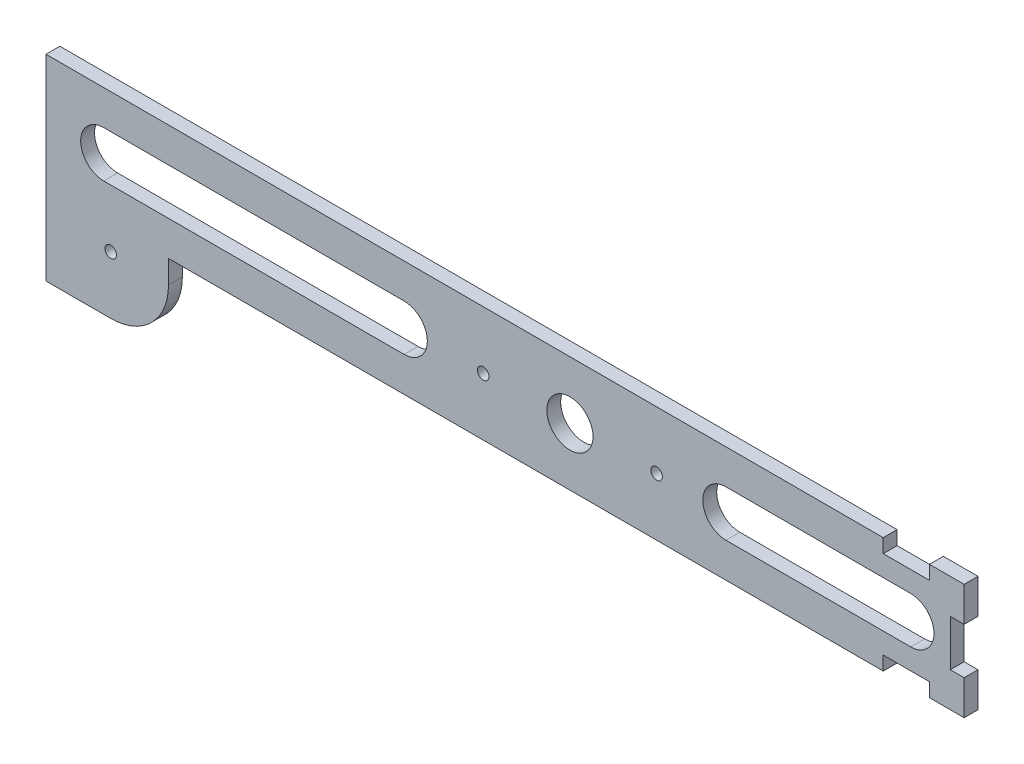
ISO-10303-21;
HEADER;
FILE_DESCRIPTION(('STEP AP214'),'2;1');
FILE_NAME('part.step','',(''),(''),'','','');
FILE_SCHEMA(('AUTOMOTIVE_DESIGN { 1 0 10303 214 1 1 1 1 }'));
ENDSEC;
DATA;
#1=APPLICATION_CONTEXT('core data for automotive mechanical design processes');
#2=APPLICATION_PROTOCOL_DEFINITION('international standard','automotive_design',2000,#1);
#3=PRODUCT_CONTEXT('',#1,'mechanical');
#4=PRODUCT('Part','Part','',(#3));
#5=PRODUCT_RELATED_PRODUCT_CATEGORY('part','',(#4));
#6=PRODUCT_DEFINITION_FORMATION('','',#4);
#7=PRODUCT_DEFINITION_CONTEXT('part definition',#1,'design');
#8=PRODUCT_DEFINITION('design','',#6,#7);
#9=PRODUCT_DEFINITION_SHAPE('','',#8);
#10=(LENGTH_UNIT() NAMED_UNIT(*) SI_UNIT(.MILLI.,.METRE.));
#11=(NAMED_UNIT(*) PLANE_ANGLE_UNIT() SI_UNIT($,.RADIAN.));
#12=(NAMED_UNIT(*) SI_UNIT($,.STERADIAN.) SOLID_ANGLE_UNIT());
#13=UNCERTAINTY_MEASURE_WITH_UNIT(LENGTH_MEASURE(1.E-05),#10,'distance_accuracy_value','');
#14=(GEOMETRIC_REPRESENTATION_CONTEXT(3) GLOBAL_UNCERTAINTY_ASSIGNED_CONTEXT((#13)) GLOBAL_UNIT_ASSIGNED_CONTEXT((#10,
#11,#12)) REPRESENTATION_CONTEXT('',''));
#15=CARTESIAN_POINT('',(0.,0.,0.));
#16=DIRECTION('',(0.,0.,1.));
#17=DIRECTION('',(1.,0.,0.));
#18=AXIS2_PLACEMENT_3D('',#15,#16,#17);
#19=CARTESIAN_POINT('',(28.,-60.,6.));
#20=DIRECTION('',(0.,0.,1.));
#21=DIRECTION('',(1.,0.,0.));
#22=AXIS2_PLACEMENT_3D('',#19,#20,#21);
#23=PLANE('',#22);
#24=CARTESIAN_POINT('',(28.,-60.,6.));
#25=DIRECTION('',(0.,0.,1.));
#26=DIRECTION('',(1.,0.,0.));
#27=AXIS2_PLACEMENT_3D('',#24,#25,#26);
#28=CIRCLE('',#27,2.5);
#29=CARTESIAN_POINT('',(30.5,-60.,6.));
#30=VERTEX_POINT('',#29);
#31=EDGE_CURVE('E893',#30,#30,#28,.T.);
#32=ORIENTED_EDGE('',*,*,#31,.F.);
#33=EDGE_LOOP('',(#32));
#34=FACE_BOUND('',#33,.T.);
#35=CARTESIAN_POINT('',(189.2,-25.,6.));
#36=DIRECTION('',(0.,0.,1.));
#37=DIRECTION('',(1.,0.,0.));
#38=AXIS2_PLACEMENT_3D('',#35,#36,#37);
#39=CIRCLE('',#38,2.5);
#40=CARTESIAN_POINT('',(191.7,-25.,6.));
#41=VERTEX_POINT('',#40);
#42=EDGE_CURVE('E254',#41,#41,#39,.T.);
#43=ORIENTED_EDGE('',*,*,#42,.F.);
#44=EDGE_LOOP('',(#43));
#45=FACE_BOUND('',#44,.T.);
#46=DIRECTION('',(1.,0.,0.));
#47=VECTOR('',#46,1.);
#48=CARTESIAN_POINT('',(382.27,-50.,6.));
#49=LINE('',#48,#47);
#50=CARTESIAN_POINT('',(382.27,-50.,6.));
#51=VERTEX_POINT('',#50);
#52=CARTESIAN_POINT('',(397.27,-50.,6.));
#53=VERTEX_POINT('',#52);
#54=EDGE_CURVE('E313',#51,#53,#49,.T.);
#55=ORIENTED_EDGE('',*,*,#54,.T.);
#56=DIRECTION('',(0.,1.,0.));
#57=VECTOR('',#56,1.);
#58=CARTESIAN_POINT('',(397.27,-50.,6.));
#59=LINE('',#58,#57);
#60=CARTESIAN_POINT('',(397.27,-35.,6.));
#61=VERTEX_POINT('',#60);
#62=EDGE_CURVE('E317',#53,#61,#59,.T.);
#63=ORIENTED_EDGE('',*,*,#62,.T.);
#64=DIRECTION('',(-1.,0.,0.));
#65=VECTOR('',#64,1.);
#66=CARTESIAN_POINT('',(397.27,-35.,6.));
#67=LINE('',#66,#65);
#68=CARTESIAN_POINT('',(391.27,-35.,6.));
#69=VERTEX_POINT('',#68);
#70=EDGE_CURVE('E321',#61,#69,#67,.T.);
#71=ORIENTED_EDGE('',*,*,#70,.T.);
#72=DIRECTION('',(0.,1.,0.));
#73=VECTOR('',#72,1.);
#74=CARTESIAN_POINT('',(391.27,-35.,6.));
#75=LINE('',#74,#73);
#76=CARTESIAN_POINT('',(391.27,-15.,6.));
#77=VERTEX_POINT('',#76);
#78=EDGE_CURVE('E324',#69,#77,#75,.T.);
#79=ORIENTED_EDGE('',*,*,#78,.T.);
#80=DIRECTION('',(1.,0.,0.));
#81=VECTOR('',#80,1.);
#82=CARTESIAN_POINT('',(391.27,-15.,6.));
#83=LINE('',#82,#81);
#84=CARTESIAN_POINT('',(397.27,-15.,6.));
#85=VERTEX_POINT('',#84);
#86=EDGE_CURVE('E327',#77,#85,#83,.T.);
#87=ORIENTED_EDGE('',*,*,#86,.T.);
#88=DIRECTION('',(0.,1.,0.));
#89=VECTOR('',#88,1.);
#90=CARTESIAN_POINT('',(397.27,-15.,6.));
#91=LINE('',#90,#89);
#92=CARTESIAN_POINT('',(397.27,0.,6.));
#93=VERTEX_POINT('',#92);
#94=EDGE_CURVE('E330',#85,#93,#91,.T.);
#95=ORIENTED_EDGE('',*,*,#94,.T.);
#96=DIRECTION('',(-1.,0.,0.));
#97=VECTOR('',#96,1.);
#98=CARTESIAN_POINT('',(397.27,0.,6.));
#99=LINE('',#98,#97);
#100=CARTESIAN_POINT('',(382.27,0.,6.));
#101=VERTEX_POINT('',#100);
#102=EDGE_CURVE('E333',#93,#101,#99,.T.);
#103=ORIENTED_EDGE('',*,*,#102,.T.);
#104=DIRECTION('',(0.,-1.,0.));
#105=VECTOR('',#104,1.);
#106=CARTESIAN_POINT('',(382.27,0.,6.));
#107=LINE('',#106,#105);
#108=CARTESIAN_POINT('',(382.27,-6.,6.));
#109=VERTEX_POINT('',#108);
#110=EDGE_CURVE('E336',#101,#109,#107,.T.);
#111=ORIENTED_EDGE('',*,*,#110,.T.);
#112=DIRECTION('',(-1.,0.,0.));
#113=VECTOR('',#112,1.);
#114=CARTESIAN_POINT('',(382.27,-6.,6.));
#115=LINE('',#114,#113);
#116=CARTESIAN_POINT('',(362.27,-6.,6.));
#117=VERTEX_POINT('',#116);
#118=EDGE_CURVE('E339',#109,#117,#115,.T.);
#119=ORIENTED_EDGE('',*,*,#118,.T.);
#120=DIRECTION('',(0.,1.,0.));
#121=VECTOR('',#120,1.);
#122=CARTESIAN_POINT('',(362.27,-6.,6.));
#123=LINE('',#122,#121);
#124=CARTESIAN_POINT('',(362.27,0.,6.));
#125=VERTEX_POINT('',#124);
#126=EDGE_CURVE('E342',#117,#125,#123,.T.);
#127=ORIENTED_EDGE('',*,*,#126,.T.);
#128=DIRECTION('',(-1.,0.,0.));
#129=VECTOR('',#128,1.);
#130=CARTESIAN_POINT('',(362.27,0.,6.));
#131=LINE('',#130,#129);
#132=CARTESIAN_POINT('',(0.,0.,6.));
#133=VERTEX_POINT('',#132);
#134=EDGE_CURVE('E345',#125,#133,#131,.T.);
#135=ORIENTED_EDGE('',*,*,#134,.T.);
#136=DIRECTION('',(0.,-1.,0.));
#137=VECTOR('',#136,1.);
#138=CARTESIAN_POINT('',(0.,0.,6.));
#139=LINE('',#138,#137);
#140=CARTESIAN_POINT('',(0.,-85.,6.));
#141=VERTEX_POINT('',#140);
#142=EDGE_CURVE('E348',#133,#141,#139,.T.);
#143=ORIENTED_EDGE('',*,*,#142,.T.);
#144=DIRECTION('',(1.,0.,0.));
#145=VECTOR('',#144,1.);
#146=CARTESIAN_POINT('',(0.,-85.,6.));
#147=LINE('',#146,#145);
#148=CARTESIAN_POINT('',(28.,-85.,6.));
#149=VERTEX_POINT('',#148);
#150=EDGE_CURVE('E351',#141,#149,#147,.T.);
#151=ORIENTED_EDGE('',*,*,#150,.T.);
#152=CARTESIAN_POINT('',(28.,-60.,6.));
#153=DIRECTION('',(0.,0.,1.));
#154=DIRECTION('',(1.,0.,0.));
#155=AXIS2_PLACEMENT_3D('',#152,#153,#154);
#156=CIRCLE('',#155,25.);
#157=CARTESIAN_POINT('',(53.,-60.,6.));
#158=VERTEX_POINT('',#157);
#159=EDGE_CURVE('E354',#149,#158,#156,.T.);
#160=ORIENTED_EDGE('',*,*,#159,.T.);
#161=DIRECTION('',(0.,1.,0.));
#162=VECTOR('',#161,1.);
#163=CARTESIAN_POINT('',(53.,-60.,6.));
#164=LINE('',#163,#162);
#165=CARTESIAN_POINT('',(53.,-50.,6.));
#166=VERTEX_POINT('',#165);
#167=EDGE_CURVE('E357',#158,#166,#164,.T.);
#168=ORIENTED_EDGE('',*,*,#167,.T.);
#169=DIRECTION('',(1.,0.,0.));
#170=VECTOR('',#169,1.);
#171=CARTESIAN_POINT('',(53.,-50.,6.));
#172=LINE('',#171,#170);
#173=CARTESIAN_POINT('',(362.27,-50.,6.));
#174=VERTEX_POINT('',#173);
#175=EDGE_CURVE('E360',#166,#174,#172,.T.);
#176=ORIENTED_EDGE('',*,*,#175,.T.);
#177=DIRECTION('',(0.,1.,0.));
#178=VECTOR('',#177,1.);
#179=CARTESIAN_POINT('',(362.27,-50.,6.));
#180=LINE('',#179,#178);
#181=CARTESIAN_POINT('',(362.27,-44.,6.));
#182=VERTEX_POINT('',#181);
#183=EDGE_CURVE('E363',#174,#182,#180,.T.);
#184=ORIENTED_EDGE('',*,*,#183,.T.);
#185=DIRECTION('',(1.,0.,0.));
#186=VECTOR('',#185,1.);
#187=CARTESIAN_POINT('',(362.27,-44.,6.));
#188=LINE('',#187,#186);
#189=CARTESIAN_POINT('',(382.27,-44.,6.));
#190=VERTEX_POINT('',#189);
#191=EDGE_CURVE('E366',#182,#190,#188,.T.);
#192=ORIENTED_EDGE('',*,*,#191,.T.);
#193=DIRECTION('',(0.,-1.,0.));
#194=VECTOR('',#193,1.);
#195=CARTESIAN_POINT('',(382.27,-44.,6.));
#196=LINE('',#195,#194);
#197=EDGE_CURVE('E369',#190,#51,#196,.T.);
#198=ORIENTED_EDGE('',*,*,#197,.T.);
#199=EDGE_LOOP('',(#55,#63,#71,#79,#87,#95,#103,#111,#119,#127,#135,#143,#151,#160,#168,#176,
#184,#192,#198));
#200=FACE_BOUND('',#199,.T.);
#201=DIRECTION('',(-1.,0.,0.));
#202=VECTOR('',#201,1.);
#203=CARTESIAN_POINT('',(155.,-15.,6.));
#204=LINE('',#203,#202);
#205=CARTESIAN_POINT('',(155.,-15.,6.));
#206=VERTEX_POINT('',#205);
#207=CARTESIAN_POINT('',(25.,-15.,6.));
#208=VERTEX_POINT('',#207);
#209=EDGE_CURVE('E273',#206,#208,#204,.T.);
#210=ORIENTED_EDGE('',*,*,#209,.F.);
#211=CARTESIAN_POINT('',(155.,-25.,6.));
#212=DIRECTION('',(0.,0.,1.));
#213=DIRECTION('',(1.,0.,0.));
#214=AXIS2_PLACEMENT_3D('',#211,#212,#213);
#215=CIRCLE('',#214,9.99999999999999);
#216=CARTESIAN_POINT('',(155.,-35.,6.));
#217=VERTEX_POINT('',#216);
#218=EDGE_CURVE('E270',#217,#206,#215,.T.);
#219=ORIENTED_EDGE('',*,*,#218,.F.);
#220=DIRECTION('',(1.,0.,0.));
#221=VECTOR('',#220,1.);
#222=CARTESIAN_POINT('',(24.9999999999999,-35.,6.));
#223=LINE('',#222,#221);
#224=CARTESIAN_POINT('',(24.9999999999999,-35.,6.));
#225=VERTEX_POINT('',#224);
#226=EDGE_CURVE('E281',#225,#217,#223,.T.);
#227=ORIENTED_EDGE('',*,*,#226,.F.);
#228=CARTESIAN_POINT('',(25.,-25.,6.));
#229=DIRECTION('',(0.,0.,1.));
#230=DIRECTION('',(1.,0.,0.));
#231=AXIS2_PLACEMENT_3D('',#228,#229,#230);
#232=CIRCLE('',#231,9.99999999999999);
#233=EDGE_CURVE('E277',#208,#225,#232,.T.);
#234=ORIENTED_EDGE('',*,*,#233,.F.);
#235=EDGE_LOOP('',(#210,#219,#227,#234));
#236=FACE_BOUND('',#235,.T.);
#237=DIRECTION('',(-1.,0.,0.));
#238=VECTOR('',#237,1.);
#239=CARTESIAN_POINT('',(374.2,-15.,6.));
#240=LINE('',#239,#238);
#241=CARTESIAN_POINT('',(374.2,-15.,6.));
#242=VERTEX_POINT('',#241);
#243=CARTESIAN_POINT('',(294.2,-15.,6.));
#244=VERTEX_POINT('',#243);
#245=EDGE_CURVE('E228',#242,#244,#240,.T.);
#246=ORIENTED_EDGE('',*,*,#245,.F.);
#247=CARTESIAN_POINT('',(374.2,-25.,6.));
#248=DIRECTION('',(0.,0.,1.));
#249=DIRECTION('',(1.,0.,0.));
#250=AXIS2_PLACEMENT_3D('',#247,#248,#249);
#251=CIRCLE('',#250,10.);
#252=CARTESIAN_POINT('',(374.2,-35.,6.));
#253=VERTEX_POINT('',#252);
#254=EDGE_CURVE('E219',#253,#242,#251,.T.);
#255=ORIENTED_EDGE('',*,*,#254,.F.);
#256=DIRECTION('',(1.,0.,0.));
#257=VECTOR('',#256,1.);
#258=CARTESIAN_POINT('',(294.2,-35.,6.));
#259=LINE('',#258,#257);
#260=CARTESIAN_POINT('',(294.2,-35.,6.));
#261=VERTEX_POINT('',#260);
#262=EDGE_CURVE('E246',#261,#253,#259,.T.);
#263=ORIENTED_EDGE('',*,*,#262,.F.);
#264=CARTESIAN_POINT('',(294.2,-25.,6.));
#265=DIRECTION('',(0.,0.,1.));
#266=DIRECTION('',(1.,0.,0.));
#267=AXIS2_PLACEMENT_3D('',#264,#265,#266);
#268=CIRCLE('',#267,10.);
#269=EDGE_CURVE('E242',#244,#261,#268,.T.);
#270=ORIENTED_EDGE('',*,*,#269,.F.);
#271=EDGE_LOOP('',(#246,#255,#263,#270));
#272=FACE_BOUND('',#271,.T.);
#273=CARTESIAN_POINT('',(226.7,-25.,6.));
#274=DIRECTION('',(0.,0.,1.));
#275=DIRECTION('',(1.,0.,0.));
#276=AXIS2_PLACEMENT_3D('',#273,#274,#275);
#277=CIRCLE('',#276,10.);
#278=CARTESIAN_POINT('',(236.7,-25.,6.));
#279=VERTEX_POINT('',#278);
#280=EDGE_CURVE('E901',#279,#279,#277,.T.);
#281=ORIENTED_EDGE('',*,*,#280,.F.);
#282=EDGE_LOOP('',(#281));
#283=FACE_BOUND('',#282,.T.);
#284=CARTESIAN_POINT('',(264.2,-25.,6.));
#285=DIRECTION('',(0.,0.,1.));
#286=DIRECTION('',(1.,0.,0.));
#287=AXIS2_PLACEMENT_3D('',#284,#285,#286);
#288=CIRCLE('',#287,2.50000000000002);
#289=CARTESIAN_POINT('',(266.7,-25.,6.));
#290=VERTEX_POINT('',#289);
#291=EDGE_CURVE('E882',#290,#290,#288,.T.);
#292=ORIENTED_EDGE('',*,*,#291,.F.);
#293=EDGE_LOOP('',(#292));
#294=FACE_BOUND('',#293,.T.);
#295=ADVANCED_FACE('F39',(#34,#45,#200,#236,#272,#283,#294),#23,.T.);
#296=CARTESIAN_POINT('',(28.,-60.,0.));
#297=DIRECTION('',(0.,0.,1.));
#298=DIRECTION('',(1.,0.,0.));
#299=AXIS2_PLACEMENT_3D('',#296,#297,#298);
#300=PLANE('',#299);
#301=CARTESIAN_POINT('',(155.,-25.,0.));
#302=DIRECTION('',(0.,0.,1.));
#303=DIRECTION('',(1.,0.,0.));
#304=AXIS2_PLACEMENT_3D('',#301,#302,#303);
#305=CIRCLE('',#304,9.99999999999999);
#306=CARTESIAN_POINT('',(155.,-35.,0.));
#307=VERTEX_POINT('',#306);
#308=CARTESIAN_POINT('',(155.,-15.,0.));
#309=VERTEX_POINT('',#308);
#310=EDGE_CURVE('E237',#307,#309,#305,.T.);
#311=ORIENTED_EDGE('',*,*,#310,.T.);
#312=DIRECTION('',(-1.,0.,0.));
#313=VECTOR('',#312,1.);
#314=CARTESIAN_POINT('',(155.,-15.,0.));
#315=LINE('',#314,#313);
#316=CARTESIAN_POINT('',(25.,-15.,0.));
#317=VERTEX_POINT('',#316);
#318=EDGE_CURVE('E288',#309,#317,#315,.T.);
#319=ORIENTED_EDGE('',*,*,#318,.T.);
#320=CARTESIAN_POINT('',(25.,-25.,0.));
#321=DIRECTION('',(0.,0.,1.));
#322=DIRECTION('',(1.,0.,0.));
#323=AXIS2_PLACEMENT_3D('',#320,#321,#322);
#324=CIRCLE('',#323,9.99999999999999);
#325=CARTESIAN_POINT('',(24.9999999999999,-35.,0.));
#326=VERTEX_POINT('',#325);
#327=EDGE_CURVE('E292',#317,#326,#324,.T.);
#328=ORIENTED_EDGE('',*,*,#327,.T.);
#329=DIRECTION('',(1.,0.,0.));
#330=VECTOR('',#329,1.);
#331=CARTESIAN_POINT('',(24.9999999999999,-35.,0.));
#332=LINE('',#331,#330);
#333=EDGE_CURVE('E274',#326,#307,#332,.T.);
#334=ORIENTED_EDGE('',*,*,#333,.T.);
#335=EDGE_LOOP('',(#311,#319,#328,#334));
#336=FACE_BOUND('',#335,.T.);
#337=DIRECTION('',(1.,0.,0.));
#338=VECTOR('',#337,1.);
#339=CARTESIAN_POINT('',(382.27,-50.,0.));
#340=LINE('',#339,#338);
#341=CARTESIAN_POINT('',(382.27,-50.,0.));
#342=VERTEX_POINT('',#341);
#343=CARTESIAN_POINT('',(397.27,-50.,0.));
#344=VERTEX_POINT('',#343);
#345=EDGE_CURVE('E312',#342,#344,#340,.T.);
#346=ORIENTED_EDGE('',*,*,#345,.F.);
#347=DIRECTION('',(0.,-1.,0.));
#348=VECTOR('',#347,1.);
#349=CARTESIAN_POINT('',(382.27,-44.,0.));
#350=LINE('',#349,#348);
#351=CARTESIAN_POINT('',(382.27,-44.,0.));
#352=VERTEX_POINT('',#351);
#353=EDGE_CURVE('E318',#352,#342,#350,.T.);
#354=ORIENTED_EDGE('',*,*,#353,.F.);
#355=DIRECTION('',(1.,0.,0.));
#356=VECTOR('',#355,1.);
#357=CARTESIAN_POINT('',(362.27,-44.,0.));
#358=LINE('',#357,#356);
#359=CARTESIAN_POINT('',(362.27,-44.,0.));
#360=VERTEX_POINT('',#359);
#361=EDGE_CURVE('E424',#360,#352,#358,.T.);
#362=ORIENTED_EDGE('',*,*,#361,.F.);
#363=DIRECTION('',(0.,1.,0.));
#364=VECTOR('',#363,1.);
#365=CARTESIAN_POINT('',(362.27,-50.,0.));
#366=LINE('',#365,#364);
#367=CARTESIAN_POINT('',(362.27,-50.,0.));
#368=VERTEX_POINT('',#367);
#369=EDGE_CURVE('E421',#368,#360,#366,.T.);
#370=ORIENTED_EDGE('',*,*,#369,.F.);
#371=DIRECTION('',(1.,0.,0.));
#372=VECTOR('',#371,1.);
#373=CARTESIAN_POINT('',(53.,-50.,0.));
#374=LINE('',#373,#372);
#375=CARTESIAN_POINT('',(53.,-50.,0.));
#376=VERTEX_POINT('',#375);
#377=EDGE_CURVE('E418',#376,#368,#374,.T.);
#378=ORIENTED_EDGE('',*,*,#377,.F.);
#379=DIRECTION('',(0.,1.,0.));
#380=VECTOR('',#379,1.);
#381=CARTESIAN_POINT('',(53.,-60.,0.));
#382=LINE('',#381,#380);
#383=CARTESIAN_POINT('',(53.,-60.,0.));
#384=VERTEX_POINT('',#383);
#385=EDGE_CURVE('E415',#384,#376,#382,.T.);
#386=ORIENTED_EDGE('',*,*,#385,.F.);
#387=CARTESIAN_POINT('',(28.,-60.,0.));
#388=DIRECTION('',(0.,0.,1.));
#389=DIRECTION('',(1.,0.,0.));
#390=AXIS2_PLACEMENT_3D('',#387,#388,#389);
#391=CIRCLE('',#390,25.);
#392=CARTESIAN_POINT('',(28.,-85.,0.));
#393=VERTEX_POINT('',#392);
#394=EDGE_CURVE('E412',#393,#384,#391,.T.);
#395=ORIENTED_EDGE('',*,*,#394,.F.);
#396=DIRECTION('',(1.,0.,0.));
#397=VECTOR('',#396,1.);
#398=CARTESIAN_POINT('',(0.,-85.,0.));
#399=LINE('',#398,#397);
#400=CARTESIAN_POINT('',(0.,-85.,0.));
#401=VERTEX_POINT('',#400);
#402=EDGE_CURVE('E409',#401,#393,#399,.T.);
#403=ORIENTED_EDGE('',*,*,#402,.F.);
#404=DIRECTION('',(0.,-1.,0.));
#405=VECTOR('',#404,1.);
#406=CARTESIAN_POINT('',(0.,0.,0.));
#407=LINE('',#406,#405);
#408=CARTESIAN_POINT('',(0.,0.,0.));
#409=VERTEX_POINT('',#408);
#410=EDGE_CURVE('E406',#409,#401,#407,.T.);
#411=ORIENTED_EDGE('',*,*,#410,.F.);
#412=DIRECTION('',(-1.,0.,0.));
#413=VECTOR('',#412,1.);
#414=CARTESIAN_POINT('',(362.27,0.,0.));
#415=LINE('',#414,#413);
#416=CARTESIAN_POINT('',(362.27,0.,0.));
#417=VERTEX_POINT('',#416);
#418=EDGE_CURVE('E403',#417,#409,#415,.T.);
#419=ORIENTED_EDGE('',*,*,#418,.F.);
#420=DIRECTION('',(0.,1.,0.));
#421=VECTOR('',#420,1.);
#422=CARTESIAN_POINT('',(362.27,-6.,0.));
#423=LINE('',#422,#421);
#424=CARTESIAN_POINT('',(362.27,-6.,0.));
#425=VERTEX_POINT('',#424);
#426=EDGE_CURVE('E400',#425,#417,#423,.T.);
#427=ORIENTED_EDGE('',*,*,#426,.F.);
#428=DIRECTION('',(-1.,0.,0.));
#429=VECTOR('',#428,1.);
#430=CARTESIAN_POINT('',(382.27,-6.,0.));
#431=LINE('',#430,#429);
#432=CARTESIAN_POINT('',(382.27,-6.,0.));
#433=VERTEX_POINT('',#432);
#434=EDGE_CURVE('E397',#433,#425,#431,.T.);
#435=ORIENTED_EDGE('',*,*,#434,.F.);
#436=DIRECTION('',(0.,-1.,0.));
#437=VECTOR('',#436,1.);
#438=CARTESIAN_POINT('',(382.27,0.,0.));
#439=LINE('',#438,#437);
#440=CARTESIAN_POINT('',(382.27,0.,0.));
#441=VERTEX_POINT('',#440);
#442=EDGE_CURVE('E394',#441,#433,#439,.T.);
#443=ORIENTED_EDGE('',*,*,#442,.F.);
#444=DIRECTION('',(-1.,0.,0.));
#445=VECTOR('',#444,1.);
#446=CARTESIAN_POINT('',(397.27,0.,0.));
#447=LINE('',#446,#445);
#448=CARTESIAN_POINT('',(397.27,0.,0.));
#449=VERTEX_POINT('',#448);
#450=EDGE_CURVE('E391',#449,#441,#447,.T.);
#451=ORIENTED_EDGE('',*,*,#450,.F.);
#452=DIRECTION('',(0.,1.,0.));
#453=VECTOR('',#452,1.);
#454=CARTESIAN_POINT('',(397.27,-15.,0.));
#455=LINE('',#454,#453);
#456=CARTESIAN_POINT('',(397.27,-15.,0.));
#457=VERTEX_POINT('',#456);
#458=EDGE_CURVE('E388',#457,#449,#455,.T.);
#459=ORIENTED_EDGE('',*,*,#458,.F.);
#460=DIRECTION('',(1.,0.,0.));
#461=VECTOR('',#460,1.);
#462=CARTESIAN_POINT('',(391.27,-15.,0.));
#463=LINE('',#462,#461);
#464=CARTESIAN_POINT('',(391.27,-15.,0.));
#465=VERTEX_POINT('',#464);
#466=EDGE_CURVE('E385',#465,#457,#463,.T.);
#467=ORIENTED_EDGE('',*,*,#466,.F.);
#468=DIRECTION('',(0.,1.,0.));
#469=VECTOR('',#468,1.);
#470=CARTESIAN_POINT('',(391.27,-35.,0.));
#471=LINE('',#470,#469);
#472=CARTESIAN_POINT('',(391.27,-35.,0.));
#473=VERTEX_POINT('',#472);
#474=EDGE_CURVE('E382',#473,#465,#471,.T.);
#475=ORIENTED_EDGE('',*,*,#474,.F.);
#476=DIRECTION('',(-1.,0.,0.));
#477=VECTOR('',#476,1.);
#478=CARTESIAN_POINT('',(397.27,-35.,0.));
#479=LINE('',#478,#477);
#480=CARTESIAN_POINT('',(397.27,-35.,0.));
#481=VERTEX_POINT('',#480);
#482=EDGE_CURVE('E379',#481,#473,#479,.T.);
#483=ORIENTED_EDGE('',*,*,#482,.F.);
#484=DIRECTION('',(0.,1.,0.));
#485=VECTOR('',#484,1.);
#486=CARTESIAN_POINT('',(397.27,-50.,0.));
#487=LINE('',#486,#485);
#488=EDGE_CURVE('E376',#344,#481,#487,.T.);
#489=ORIENTED_EDGE('',*,*,#488,.F.);
#490=EDGE_LOOP('',(#346,#354,#362,#370,#378,#386,#395,#403,#411,#419,#427,#435,#443,#451,#459,
#467,#475,#483,#489));
#491=FACE_BOUND('',#490,.T.);
#492=CARTESIAN_POINT('',(374.2,-25.,0.));
#493=DIRECTION('',(0.,0.,1.));
#494=DIRECTION('',(1.,0.,0.));
#495=AXIS2_PLACEMENT_3D('',#492,#493,#494);
#496=CIRCLE('',#495,10.);
#497=CARTESIAN_POINT('',(374.2,-35.,0.));
#498=VERTEX_POINT('',#497);
#499=CARTESIAN_POINT('',(374.2,-15.,0.));
#500=VERTEX_POINT('',#499);
#501=EDGE_CURVE('E63',#498,#500,#496,.T.);
#502=ORIENTED_EDGE('',*,*,#501,.T.);
#503=DIRECTION('',(-1.,0.,0.));
#504=VECTOR('',#503,1.);
#505=CARTESIAN_POINT('',(374.2,-15.,0.));
#506=LINE('',#505,#504);
#507=CARTESIAN_POINT('',(294.2,-15.,0.));
#508=VERTEX_POINT('',#507);
#509=EDGE_CURVE('E235',#500,#508,#506,.T.);
#510=ORIENTED_EDGE('',*,*,#509,.T.);
#511=CARTESIAN_POINT('',(294.2,-25.,0.));
#512=DIRECTION('',(0.,0.,1.));
#513=DIRECTION('',(1.,0.,0.));
#514=AXIS2_PLACEMENT_3D('',#511,#512,#513);
#515=CIRCLE('',#514,10.);
#516=CARTESIAN_POINT('',(294.2,-35.,0.));
#517=VERTEX_POINT('',#516);
#518=EDGE_CURVE('E257',#508,#517,#515,.T.);
#519=ORIENTED_EDGE('',*,*,#518,.T.);
#520=DIRECTION('',(1.,0.,0.));
#521=VECTOR('',#520,1.);
#522=CARTESIAN_POINT('',(294.2,-35.,0.));
#523=LINE('',#522,#521);
#524=EDGE_CURVE('E229',#517,#498,#523,.T.);
#525=ORIENTED_EDGE('',*,*,#524,.T.);
#526=EDGE_LOOP('',(#502,#510,#519,#525));
#527=FACE_BOUND('',#526,.T.);
#528=CARTESIAN_POINT('',(189.2,-25.,0.));
#529=DIRECTION('',(0.,0.,1.));
#530=DIRECTION('',(1.,0.,0.));
#531=AXIS2_PLACEMENT_3D('',#528,#529,#530);
#532=CIRCLE('',#531,2.5);
#533=CARTESIAN_POINT('',(191.7,-25.,0.));
#534=VERTEX_POINT('',#533);
#535=EDGE_CURVE('E905',#534,#534,#532,.T.);
#536=ORIENTED_EDGE('',*,*,#535,.T.);
#537=EDGE_LOOP('',(#536));
#538=FACE_BOUND('',#537,.T.);
#539=CARTESIAN_POINT('',(226.7,-25.,0.));
#540=DIRECTION('',(0.,0.,1.));
#541=DIRECTION('',(1.,0.,0.));
#542=AXIS2_PLACEMENT_3D('',#539,#540,#541);
#543=CIRCLE('',#542,10.);
#544=CARTESIAN_POINT('',(236.7,-25.,0.));
#545=VERTEX_POINT('',#544);
#546=EDGE_CURVE('E897',#545,#545,#543,.T.);
#547=ORIENTED_EDGE('',*,*,#546,.T.);
#548=EDGE_LOOP('',(#547));
#549=FACE_BOUND('',#548,.T.);
#550=CARTESIAN_POINT('',(28.,-60.,0.));
#551=DIRECTION('',(0.,0.,1.));
#552=DIRECTION('',(1.,0.,0.));
#553=AXIS2_PLACEMENT_3D('',#550,#551,#552);
#554=CIRCLE('',#553,2.5);
#555=CARTESIAN_POINT('',(30.5,-60.,0.));
#556=VERTEX_POINT('',#555);
#557=EDGE_CURVE('E890',#556,#556,#554,.T.);
#558=ORIENTED_EDGE('',*,*,#557,.T.);
#559=EDGE_LOOP('',(#558));
#560=FACE_BOUND('',#559,.T.);
#561=CARTESIAN_POINT('',(264.2,-25.,0.));
#562=DIRECTION('',(0.,0.,1.));
#563=DIRECTION('',(1.,0.,0.));
#564=AXIS2_PLACEMENT_3D('',#561,#562,#563);
#565=CIRCLE('',#564,2.50000000000002);
#566=CARTESIAN_POINT('',(266.7,-25.,0.));
#567=VERTEX_POINT('',#566);
#568=EDGE_CURVE('E885',#567,#567,#565,.T.);
#569=ORIENTED_EDGE('',*,*,#568,.T.);
#570=EDGE_LOOP('',(#569));
#571=FACE_BOUND('',#570,.T.);
#572=ADVANCED_FACE('F507',(#336,#491,#527,#538,#549,#560,#571),#300,.F.);
#573=CARTESIAN_POINT('',(382.27,-50.,6.));
#574=DIRECTION('',(0.,1.,0.));
#575=DIRECTION('',(0.,0.,1.));
#576=AXIS2_PLACEMENT_3D('',#573,#574,#575);
#577=PLANE('',#576);
#578=ORIENTED_EDGE('',*,*,#345,.T.);
#579=DIRECTION('',(0.,0.,-1.));
#580=VECTOR('',#579,1.);
#581=CARTESIAN_POINT('',(397.27,-50.,6.));
#582=LINE('',#581,#580);
#583=EDGE_CURVE('E11',#53,#344,#582,.T.);
#584=ORIENTED_EDGE('',*,*,#583,.F.);
#585=ORIENTED_EDGE('',*,*,#54,.F.);
#586=DIRECTION('',(0.,0.,-1.));
#587=VECTOR('',#586,1.);
#588=CARTESIAN_POINT('',(382.27,-50.,6.));
#589=LINE('',#588,#587);
#590=EDGE_CURVE('E372',#51,#342,#589,.T.);
#591=ORIENTED_EDGE('',*,*,#590,.T.);
#592=EDGE_LOOP('',(#578,#584,#585,#591));
#593=FACE_BOUND('',#592,.T.);
#594=ADVANCED_FACE('F41',(#593),#577,.F.);
#595=CARTESIAN_POINT('',(397.27,-50.,6.));
#596=DIRECTION('',(-1.,0.,0.));
#597=DIRECTION('',(0.,0.,1.));
#598=AXIS2_PLACEMENT_3D('',#595,#596,#597);
#599=PLANE('',#598);
#600=ORIENTED_EDGE('',*,*,#488,.T.);
#601=DIRECTION('',(0.,0.,-1.));
#602=VECTOR('',#601,1.);
#603=CARTESIAN_POINT('',(397.27,-35.,6.));
#604=LINE('',#603,#602);
#605=EDGE_CURVE('E48',#61,#481,#604,.T.);
#606=ORIENTED_EDGE('',*,*,#605,.F.);
#607=ORIENTED_EDGE('',*,*,#62,.F.);
#608=ORIENTED_EDGE('',*,*,#583,.T.);
#609=EDGE_LOOP('',(#600,#606,#607,#608));
#610=FACE_BOUND('',#609,.T.);
#611=ADVANCED_FACE('F525',(#610),#599,.F.);
#612=CARTESIAN_POINT('',(397.27,-35.,6.));
#613=DIRECTION('',(0.,-1.,0.));
#614=DIRECTION('',(0.,0.,-1.));
#615=AXIS2_PLACEMENT_3D('',#612,#613,#614);
#616=PLANE('',#615);
#617=ORIENTED_EDGE('',*,*,#482,.T.);
#618=DIRECTION('',(0.,0.,-1.));
#619=VECTOR('',#618,1.);
#620=CARTESIAN_POINT('',(391.27,-35.,6.));
#621=LINE('',#620,#619);
#622=EDGE_CURVE('E492',#69,#473,#621,.T.);
#623=ORIENTED_EDGE('',*,*,#622,.F.);
#624=ORIENTED_EDGE('',*,*,#70,.F.);
#625=ORIENTED_EDGE('',*,*,#605,.T.);
#626=EDGE_LOOP('',(#617,#623,#624,#625));
#627=FACE_BOUND('',#626,.T.);
#628=ADVANCED_FACE('F501',(#627),#616,.F.);
#629=CARTESIAN_POINT('',(391.27,-35.,6.));
#630=DIRECTION('',(-1.,0.,0.));
#631=DIRECTION('',(0.,0.,1.));
#632=AXIS2_PLACEMENT_3D('',#629,#630,#631);
#633=PLANE('',#632);
#634=ORIENTED_EDGE('',*,*,#474,.T.);
#635=DIRECTION('',(0.,0.,-1.));
#636=VECTOR('',#635,1.);
#637=CARTESIAN_POINT('',(391.27,-15.,6.));
#638=LINE('',#637,#636);
#639=EDGE_CURVE('E488',#77,#465,#638,.T.);
#640=ORIENTED_EDGE('',*,*,#639,.F.);
#641=ORIENTED_EDGE('',*,*,#78,.F.);
#642=ORIENTED_EDGE('',*,*,#622,.T.);
#643=EDGE_LOOP('',(#634,#640,#641,#642));
#644=FACE_BOUND('',#643,.T.);
#645=ADVANCED_FACE('F513',(#644),#633,.F.);
#646=CARTESIAN_POINT('',(391.27,-15.,6.));
#647=DIRECTION('',(0.,1.,0.));
#648=DIRECTION('',(0.,0.,1.));
#649=AXIS2_PLACEMENT_3D('',#646,#647,#648);
#650=PLANE('',#649);
#651=ORIENTED_EDGE('',*,*,#466,.T.);
#652=DIRECTION('',(0.,0.,-1.));
#653=VECTOR('',#652,1.);
#654=CARTESIAN_POINT('',(397.27,-15.,6.));
#655=LINE('',#654,#653);
#656=EDGE_CURVE('E484',#85,#457,#655,.T.);
#657=ORIENTED_EDGE('',*,*,#656,.F.);
#658=ORIENTED_EDGE('',*,*,#86,.F.);
#659=ORIENTED_EDGE('',*,*,#639,.T.);
#660=EDGE_LOOP('',(#651,#657,#658,#659));
#661=FACE_BOUND('',#660,.T.);
#662=ADVANCED_FACE('F517',(#661),#650,.F.);
#663=CARTESIAN_POINT('',(397.27,-15.,6.));
#664=DIRECTION('',(-1.,0.,0.));
#665=DIRECTION('',(0.,0.,1.));
#666=AXIS2_PLACEMENT_3D('',#663,#664,#665);
#667=PLANE('',#666);
#668=ORIENTED_EDGE('',*,*,#458,.T.);
#669=DIRECTION('',(0.,0.,-1.));
#670=VECTOR('',#669,1.);
#671=CARTESIAN_POINT('',(397.27,0.,6.));
#672=LINE('',#671,#670);
#673=EDGE_CURVE('E480',#93,#449,#672,.T.);
#674=ORIENTED_EDGE('',*,*,#673,.F.);
#675=ORIENTED_EDGE('',*,*,#94,.F.);
#676=ORIENTED_EDGE('',*,*,#656,.T.);
#677=EDGE_LOOP('',(#668,#674,#675,#676));
#678=FACE_BOUND('',#677,.T.);
#679=ADVANCED_FACE('F593',(#678),#667,.F.);
#680=CARTESIAN_POINT('',(397.27,0.,6.));
#681=DIRECTION('',(0.,-1.,0.));
#682=DIRECTION('',(0.,0.,-1.));
#683=AXIS2_PLACEMENT_3D('',#680,#681,#682);
#684=PLANE('',#683);
#685=ORIENTED_EDGE('',*,*,#450,.T.);
#686=DIRECTION('',(0.,0.,-1.));
#687=VECTOR('',#686,1.);
#688=CARTESIAN_POINT('',(382.27,0.,6.));
#689=LINE('',#688,#687);
#690=EDGE_CURVE('E476',#101,#441,#689,.T.);
#691=ORIENTED_EDGE('',*,*,#690,.F.);
#692=ORIENTED_EDGE('',*,*,#102,.F.);
#693=ORIENTED_EDGE('',*,*,#673,.T.);
#694=EDGE_LOOP('',(#685,#691,#692,#693));
#695=FACE_BOUND('',#694,.T.);
#696=ADVANCED_FACE('F590',(#695),#684,.F.);
#697=CARTESIAN_POINT('',(382.27,0.,6.));
#698=DIRECTION('',(1.,0.,0.));
#699=DIRECTION('',(0.,0.,-1.));
#700=AXIS2_PLACEMENT_3D('',#697,#698,#699);
#701=PLANE('',#700);
#702=ORIENTED_EDGE('',*,*,#442,.T.);
#703=DIRECTION('',(0.,0.,-1.));
#704=VECTOR('',#703,1.);
#705=CARTESIAN_POINT('',(382.27,-6.,6.));
#706=LINE('',#705,#704);
#707=EDGE_CURVE('E472',#109,#433,#706,.T.);
#708=ORIENTED_EDGE('',*,*,#707,.F.);
#709=ORIENTED_EDGE('',*,*,#110,.F.);
#710=ORIENTED_EDGE('',*,*,#690,.T.);
#711=EDGE_LOOP('',(#702,#708,#709,#710));
#712=FACE_BOUND('',#711,.T.);
#713=ADVANCED_FACE('F586',(#712),#701,.F.);
#714=CARTESIAN_POINT('',(382.27,-6.,6.));
#715=DIRECTION('',(0.,-1.,0.));
#716=DIRECTION('',(0.,0.,-1.));
#717=AXIS2_PLACEMENT_3D('',#714,#715,#716);
#718=PLANE('',#717);
#719=ORIENTED_EDGE('',*,*,#434,.T.);
#720=DIRECTION('',(0.,0.,-1.));
#721=VECTOR('',#720,1.);
#722=CARTESIAN_POINT('',(362.27,-6.,6.));
#723=LINE('',#722,#721);
#724=EDGE_CURVE('E468',#117,#425,#723,.T.);
#725=ORIENTED_EDGE('',*,*,#724,.F.);
#726=ORIENTED_EDGE('',*,*,#118,.F.);
#727=ORIENTED_EDGE('',*,*,#707,.T.);
#728=EDGE_LOOP('',(#719,#725,#726,#727));
#729=FACE_BOUND('',#728,.T.);
#730=ADVANCED_FACE('F582',(#729),#718,.F.);
#731=CARTESIAN_POINT('',(362.27,-6.,6.));
#732=DIRECTION('',(-1.,0.,0.));
#733=DIRECTION('',(0.,0.,1.));
#734=AXIS2_PLACEMENT_3D('',#731,#732,#733);
#735=PLANE('',#734);
#736=ORIENTED_EDGE('',*,*,#426,.T.);
#737=DIRECTION('',(0.,0.,-1.));
#738=VECTOR('',#737,1.);
#739=CARTESIAN_POINT('',(362.27,0.,6.));
#740=LINE('',#739,#738);
#741=EDGE_CURVE('E464',#125,#417,#740,.T.);
#742=ORIENTED_EDGE('',*,*,#741,.F.);
#743=ORIENTED_EDGE('',*,*,#126,.F.);
#744=ORIENTED_EDGE('',*,*,#724,.T.);
#745=EDGE_LOOP('',(#736,#742,#743,#744));
#746=FACE_BOUND('',#745,.T.);
#747=ADVANCED_FACE('F577',(#746),#735,.F.);
#748=CARTESIAN_POINT('',(362.27,0.,6.));
#749=DIRECTION('',(0.,-1.,0.));
#750=DIRECTION('',(0.,0.,-1.));
#751=AXIS2_PLACEMENT_3D('',#748,#749,#750);
#752=PLANE('',#751);
#753=ORIENTED_EDGE('',*,*,#418,.T.);
#754=DIRECTION('',(0.,0.,-1.));
#755=VECTOR('',#754,1.);
#756=CARTESIAN_POINT('',(0.,0.,6.));
#757=LINE('',#756,#755);
#758=EDGE_CURVE('E460',#133,#409,#757,.T.);
#759=ORIENTED_EDGE('',*,*,#758,.F.);
#760=ORIENTED_EDGE('',*,*,#134,.F.);
#761=ORIENTED_EDGE('',*,*,#741,.T.);
#762=EDGE_LOOP('',(#753,#759,#760,#761));
#763=FACE_BOUND('',#762,.T.);
#764=ADVANCED_FACE('F571',(#763),#752,.F.);
#765=CARTESIAN_POINT('',(0.,0.,6.));
#766=DIRECTION('',(1.,0.,0.));
#767=DIRECTION('',(0.,1.,0.));
#768=AXIS2_PLACEMENT_3D('',#765,#766,#767);
#769=PLANE('',#768);
#770=ORIENTED_EDGE('',*,*,#410,.T.);
#771=DIRECTION('',(0.,0.,-1.));
#772=VECTOR('',#771,1.);
#773=CARTESIAN_POINT('',(0.,-85.,6.));
#774=LINE('',#773,#772);
#775=EDGE_CURVE('E456',#141,#401,#774,.T.);
#776=ORIENTED_EDGE('',*,*,#775,.F.);
#777=ORIENTED_EDGE('',*,*,#142,.F.);
#778=ORIENTED_EDGE('',*,*,#758,.T.);
#779=EDGE_LOOP('',(#770,#776,#777,#778));
#780=FACE_BOUND('',#779,.T.);
#781=ADVANCED_FACE('F567',(#780),#769,.F.);
#782=CARTESIAN_POINT('',(0.,-85.,6.));
#783=DIRECTION('',(0.,1.,0.));
#784=DIRECTION('',(0.,0.,1.));
#785=AXIS2_PLACEMENT_3D('',#782,#783,#784);
#786=PLANE('',#785);
#787=ORIENTED_EDGE('',*,*,#402,.T.);
#788=DIRECTION('',(0.,0.,-1.));
#789=VECTOR('',#788,1.);
#790=CARTESIAN_POINT('',(28.,-85.,6.));
#791=LINE('',#790,#789);
#792=EDGE_CURVE('E452',#149,#393,#791,.T.);
#793=ORIENTED_EDGE('',*,*,#792,.F.);
#794=ORIENTED_EDGE('',*,*,#150,.F.);
#795=ORIENTED_EDGE('',*,*,#775,.T.);
#796=EDGE_LOOP('',(#787,#793,#794,#795));
#797=FACE_BOUND('',#796,.T.);
#798=ADVANCED_FACE('F562',(#797),#786,.F.);
#799=CARTESIAN_POINT('',(28.,-60.,6.));
#800=DIRECTION('',(0.,0.,-1.));
#801=DIRECTION('',(-1.,0.,0.));
#802=AXIS2_PLACEMENT_3D('',#799,#800,#801);
#803=CYLINDRICAL_SURFACE('',#802,25.);
#804=ORIENTED_EDGE('',*,*,#394,.T.);
#805=DIRECTION('',(0.,0.,-1.));
#806=VECTOR('',#805,1.);
#807=CARTESIAN_POINT('',(53.,-60.,6.));
#808=LINE('',#807,#806);
#809=EDGE_CURVE('E448',#158,#384,#808,.T.);
#810=ORIENTED_EDGE('',*,*,#809,.F.);
#811=ORIENTED_EDGE('',*,*,#159,.F.);
#812=ORIENTED_EDGE('',*,*,#792,.T.);
#813=EDGE_LOOP('',(#804,#810,#811,#812));
#814=FACE_BOUND('',#813,.T.);
#815=ADVANCED_FACE('F556',(#814),#803,.T.);
#816=CARTESIAN_POINT('',(53.,-60.,6.));
#817=DIRECTION('',(-1.,0.,0.));
#818=DIRECTION('',(0.,0.,1.));
#819=AXIS2_PLACEMENT_3D('',#816,#817,#818);
#820=PLANE('',#819);
#821=ORIENTED_EDGE('',*,*,#385,.T.);
#822=DIRECTION('',(0.,0.,-1.));
#823=VECTOR('',#822,1.);
#824=CARTESIAN_POINT('',(53.,-50.,6.));
#825=LINE('',#824,#823);
#826=EDGE_CURVE('E444',#166,#376,#825,.T.);
#827=ORIENTED_EDGE('',*,*,#826,.F.);
#828=ORIENTED_EDGE('',*,*,#167,.F.);
#829=ORIENTED_EDGE('',*,*,#809,.T.);
#830=EDGE_LOOP('',(#821,#827,#828,#829));
#831=FACE_BOUND('',#830,.T.);
#832=ADVANCED_FACE('F552',(#831),#820,.F.);
#833=CARTESIAN_POINT('',(53.,-50.,6.));
#834=DIRECTION('',(0.,1.,0.));
#835=DIRECTION('',(0.,0.,1.));
#836=AXIS2_PLACEMENT_3D('',#833,#834,#835);
#837=PLANE('',#836);
#838=ORIENTED_EDGE('',*,*,#377,.T.);
#839=DIRECTION('',(0.,0.,-1.));
#840=VECTOR('',#839,1.);
#841=CARTESIAN_POINT('',(362.27,-50.,6.));
#842=LINE('',#841,#840);
#843=EDGE_CURVE('E440',#174,#368,#842,.T.);
#844=ORIENTED_EDGE('',*,*,#843,.F.);
#845=ORIENTED_EDGE('',*,*,#175,.F.);
#846=ORIENTED_EDGE('',*,*,#826,.T.);
#847=EDGE_LOOP('',(#838,#844,#845,#846));
#848=FACE_BOUND('',#847,.T.);
#849=ADVANCED_FACE('F547',(#848),#837,.F.);
#850=CARTESIAN_POINT('',(362.27,-50.,6.));
#851=DIRECTION('',(-1.,0.,0.));
#852=DIRECTION('',(0.,0.,1.));
#853=AXIS2_PLACEMENT_3D('',#850,#851,#852);
#854=PLANE('',#853);
#855=ORIENTED_EDGE('',*,*,#369,.T.);
#856=DIRECTION('',(0.,0.,-1.));
#857=VECTOR('',#856,1.);
#858=CARTESIAN_POINT('',(362.27,-44.,6.));
#859=LINE('',#858,#857);
#860=EDGE_CURVE('E436',#182,#360,#859,.T.);
#861=ORIENTED_EDGE('',*,*,#860,.F.);
#862=ORIENTED_EDGE('',*,*,#183,.F.);
#863=ORIENTED_EDGE('',*,*,#843,.T.);
#864=EDGE_LOOP('',(#855,#861,#862,#863));
#865=FACE_BOUND('',#864,.T.);
#866=ADVANCED_FACE('F541',(#865),#854,.F.);
#867=CARTESIAN_POINT('',(362.27,-44.,6.));
#868=DIRECTION('',(0.,1.,0.));
#869=DIRECTION('',(0.,0.,1.));
#870=AXIS2_PLACEMENT_3D('',#867,#868,#869);
#871=PLANE('',#870);
#872=ORIENTED_EDGE('',*,*,#361,.T.);
#873=DIRECTION('',(0.,0.,-1.));
#874=VECTOR('',#873,1.);
#875=CARTESIAN_POINT('',(382.27,-44.,6.));
#876=LINE('',#875,#874);
#877=EDGE_CURVE('E432',#190,#352,#876,.T.);
#878=ORIENTED_EDGE('',*,*,#877,.F.);
#879=ORIENTED_EDGE('',*,*,#191,.F.);
#880=ORIENTED_EDGE('',*,*,#860,.T.);
#881=EDGE_LOOP('',(#872,#878,#879,#880));
#882=FACE_BOUND('',#881,.T.);
#883=ADVANCED_FACE('F537',(#882),#871,.F.);
#884=CARTESIAN_POINT('',(382.27,-44.,6.));
#885=DIRECTION('',(1.,0.,0.));
#886=DIRECTION('',(0.,0.,-1.));
#887=AXIS2_PLACEMENT_3D('',#884,#885,#886);
#888=PLANE('',#887);
#889=ORIENTED_EDGE('',*,*,#353,.T.);
#890=ORIENTED_EDGE('',*,*,#590,.F.);
#891=ORIENTED_EDGE('',*,*,#197,.F.);
#892=ORIENTED_EDGE('',*,*,#877,.T.);
#893=EDGE_LOOP('',(#889,#890,#891,#892));
#894=FACE_BOUND('',#893,.T.);
#895=ADVANCED_FACE('F532',(#894),#888,.F.);
#896=CARTESIAN_POINT('',(155.,-25.,6.));
#897=DIRECTION('',(0.,0.,-1.));
#898=DIRECTION('',(-1.,0.,0.));
#899=AXIS2_PLACEMENT_3D('',#896,#897,#898);
#900=CYLINDRICAL_SURFACE('',#899,9.99999999999999);
#901=ORIENTED_EDGE('',*,*,#310,.F.);
#902=DIRECTION('',(0.,0.,-1.));
#903=VECTOR('',#902,1.);
#904=CARTESIAN_POINT('',(155.,-35.,6.));
#905=LINE('',#904,#903);
#906=EDGE_CURVE('E284',#217,#307,#905,.T.);
#907=ORIENTED_EDGE('',*,*,#906,.F.);
#908=ORIENTED_EDGE('',*,*,#218,.T.);
#909=DIRECTION('',(0.,0.,-1.));
#910=VECTOR('',#909,1.);
#911=CARTESIAN_POINT('',(155.,-15.,6.));
#912=LINE('',#911,#910);
#913=EDGE_CURVE('E308',#206,#309,#912,.T.);
#914=ORIENTED_EDGE('',*,*,#913,.T.);
#915=EDGE_LOOP('',(#901,#907,#908,#914));
#916=FACE_BOUND('',#915,.T.);
#917=ADVANCED_FACE('F613',(#916),#900,.F.);
#918=CARTESIAN_POINT('',(155.,-15.,6.));
#919=DIRECTION('',(0.,-1.,0.));
#920=DIRECTION('',(0.,0.,-1.));
#921=AXIS2_PLACEMENT_3D('',#918,#919,#920);
#922=PLANE('',#921);
#923=ORIENTED_EDGE('',*,*,#318,.F.);
#924=ORIENTED_EDGE('',*,*,#913,.F.);
#925=ORIENTED_EDGE('',*,*,#209,.T.);
#926=DIRECTION('',(0.,0.,-1.));
#927=VECTOR('',#926,1.);
#928=CARTESIAN_POINT('',(25.,-15.,6.));
#929=LINE('',#928,#927);
#930=EDGE_CURVE('E305',#208,#317,#929,.T.);
#931=ORIENTED_EDGE('',*,*,#930,.T.);
#932=EDGE_LOOP('',(#923,#924,#925,#931));
#933=FACE_BOUND('',#932,.T.);
#934=ADVANCED_FACE('F693',(#933),#922,.T.);
#935=CARTESIAN_POINT('',(25.,-25.,6.));
#936=DIRECTION('',(0.,0.,-1.));
#937=DIRECTION('',(-1.,0.,0.));
#938=AXIS2_PLACEMENT_3D('',#935,#936,#937);
#939=CYLINDRICAL_SURFACE('',#938,9.99999999999999);
#940=ORIENTED_EDGE('',*,*,#327,.F.);
#941=ORIENTED_EDGE('',*,*,#930,.F.);
#942=ORIENTED_EDGE('',*,*,#233,.T.);
#943=DIRECTION('',(0.,0.,-1.));
#944=VECTOR('',#943,1.);
#945=CARTESIAN_POINT('',(24.9999999999999,-35.,6.));
#946=LINE('',#945,#944);
#947=EDGE_CURVE('E302',#225,#326,#946,.T.);
#948=ORIENTED_EDGE('',*,*,#947,.T.);
#949=EDGE_LOOP('',(#940,#941,#942,#948));
#950=FACE_BOUND('',#949,.T.);
#951=ADVANCED_FACE('F700',(#950),#939,.F.);
#952=CARTESIAN_POINT('',(24.9999999999999,-35.,6.));
#953=DIRECTION('',(0.,1.,0.));
#954=DIRECTION('',(0.,0.,1.));
#955=AXIS2_PLACEMENT_3D('',#952,#953,#954);
#956=PLANE('',#955);
#957=ORIENTED_EDGE('',*,*,#333,.F.);
#958=ORIENTED_EDGE('',*,*,#947,.F.);
#959=ORIENTED_EDGE('',*,*,#226,.T.);
#960=ORIENTED_EDGE('',*,*,#906,.T.);
#961=EDGE_LOOP('',(#957,#958,#959,#960));
#962=FACE_BOUND('',#961,.T.);
#963=ADVANCED_FACE('F707',(#962),#956,.T.);
#964=CARTESIAN_POINT('',(374.2,-25.,6.));
#965=DIRECTION('',(0.,0.,-1.));
#966=DIRECTION('',(-1.,0.,0.));
#967=AXIS2_PLACEMENT_3D('',#964,#965,#966);
#968=CYLINDRICAL_SURFACE('',#967,10.);
#969=ORIENTED_EDGE('',*,*,#501,.F.);
#970=DIRECTION('',(0.,0.,-1.));
#971=VECTOR('',#970,1.);
#972=CARTESIAN_POINT('',(374.2,-35.,6.));
#973=LINE('',#972,#971);
#974=EDGE_CURVE('E223',#253,#498,#973,.T.);
#975=ORIENTED_EDGE('',*,*,#974,.F.);
#976=ORIENTED_EDGE('',*,*,#254,.T.);
#977=DIRECTION('',(0.,0.,-1.));
#978=VECTOR('',#977,1.);
#979=CARTESIAN_POINT('',(374.2,-15.,6.));
#980=LINE('',#979,#978);
#981=EDGE_CURVE('E222',#242,#500,#980,.T.);
#982=ORIENTED_EDGE('',*,*,#981,.T.);
#983=EDGE_LOOP('',(#969,#975,#976,#982));
#984=FACE_BOUND('',#983,.T.);
#985=ADVANCED_FACE('F221',(#984),#968,.F.);
#986=CARTESIAN_POINT('',(374.2,-15.,6.));
#987=DIRECTION('',(0.,-1.,0.));
#988=DIRECTION('',(0.,0.,-1.));
#989=AXIS2_PLACEMENT_3D('',#986,#987,#988);
#990=PLANE('',#989);
#991=ORIENTED_EDGE('',*,*,#509,.F.);
#992=ORIENTED_EDGE('',*,*,#981,.F.);
#993=ORIENTED_EDGE('',*,*,#245,.T.);
#994=DIRECTION('',(0.,0.,-1.));
#995=VECTOR('',#994,1.);
#996=CARTESIAN_POINT('',(294.2,-15.,6.));
#997=LINE('',#996,#995);
#998=EDGE_CURVE('E238',#244,#508,#997,.T.);
#999=ORIENTED_EDGE('',*,*,#998,.T.);
#1000=EDGE_LOOP('',(#991,#992,#993,#999));
#1001=FACE_BOUND('',#1000,.T.);
#1002=ADVANCED_FACE('F232',(#1001),#990,.T.);
#1003=CARTESIAN_POINT('',(294.2,-25.,6.));
#1004=DIRECTION('',(0.,0.,-1.));
#1005=DIRECTION('',(-1.,0.,0.));
#1006=AXIS2_PLACEMENT_3D('',#1003,#1004,#1005);
#1007=CYLINDRICAL_SURFACE('',#1006,10.);
#1008=ORIENTED_EDGE('',*,*,#518,.F.);
#1009=ORIENTED_EDGE('',*,*,#998,.F.);
#1010=ORIENTED_EDGE('',*,*,#269,.T.);
#1011=DIRECTION('',(0.,0.,-1.));
#1012=VECTOR('',#1011,1.);
#1013=CARTESIAN_POINT('',(294.2,-35.,6.));
#1014=LINE('',#1013,#1012);
#1015=EDGE_CURVE('E55',#261,#517,#1014,.T.);
#1016=ORIENTED_EDGE('',*,*,#1015,.T.);
#1017=EDGE_LOOP('',(#1008,#1009,#1010,#1016));
#1018=FACE_BOUND('',#1017,.T.);
#1019=ADVANCED_FACE('F728',(#1018),#1007,.F.);
#1020=CARTESIAN_POINT('',(294.2,-35.,6.));
#1021=DIRECTION('',(0.,1.,0.));
#1022=DIRECTION('',(0.,0.,1.));
#1023=AXIS2_PLACEMENT_3D('',#1020,#1021,#1022);
#1024=PLANE('',#1023);
#1025=ORIENTED_EDGE('',*,*,#524,.F.);
#1026=ORIENTED_EDGE('',*,*,#1015,.F.);
#1027=ORIENTED_EDGE('',*,*,#262,.T.);
#1028=ORIENTED_EDGE('',*,*,#974,.T.);
#1029=EDGE_LOOP('',(#1025,#1026,#1027,#1028));
#1030=FACE_BOUND('',#1029,.T.);
#1031=ADVANCED_FACE('F735',(#1030),#1024,.T.);
#1032=CARTESIAN_POINT('',(189.2,-25.,6.));
#1033=DIRECTION('',(0.,0.,-1.));
#1034=DIRECTION('',(-1.,0.,0.));
#1035=AXIS2_PLACEMENT_3D('',#1032,#1033,#1034);
#1036=CYLINDRICAL_SURFACE('',#1035,2.5);
#1037=ORIENTED_EDGE('',*,*,#42,.T.);
#1038=EDGE_LOOP('',(#1037));
#1039=FACE_BOUND('',#1038,.T.);
#1040=ORIENTED_EDGE('',*,*,#535,.F.);
#1041=EDGE_LOOP('',(#1040));
#1042=FACE_BOUND('',#1041,.T.);
#1043=ADVANCED_FACE('F743',(#1039,#1042),#1036,.F.);
#1044=CARTESIAN_POINT('',(226.7,-25.,6.));
#1045=DIRECTION('',(0.,0.,-1.));
#1046=DIRECTION('',(-1.,0.,0.));
#1047=AXIS2_PLACEMENT_3D('',#1044,#1045,#1046);
#1048=CYLINDRICAL_SURFACE('',#1047,10.);
#1049=ORIENTED_EDGE('',*,*,#280,.T.);
#1050=EDGE_LOOP('',(#1049));
#1051=FACE_BOUND('',#1050,.T.);
#1052=ORIENTED_EDGE('',*,*,#546,.F.);
#1053=EDGE_LOOP('',(#1052));
#1054=FACE_BOUND('',#1053,.T.);
#1055=ADVANCED_FACE('F750',(#1051,#1054),#1048,.F.);
#1056=CARTESIAN_POINT('',(28.,-60.,6.));
#1057=DIRECTION('',(0.,0.,-1.));
#1058=DIRECTION('',(-1.,0.,0.));
#1059=AXIS2_PLACEMENT_3D('',#1056,#1057,#1058);
#1060=CYLINDRICAL_SURFACE('',#1059,2.5);
#1061=ORIENTED_EDGE('',*,*,#31,.T.);
#1062=EDGE_LOOP('',(#1061));
#1063=FACE_BOUND('',#1062,.T.);
#1064=ORIENTED_EDGE('',*,*,#557,.F.);
#1065=EDGE_LOOP('',(#1064));
#1066=FACE_BOUND('',#1065,.T.);
#1067=ADVANCED_FACE('F758',(#1063,#1066),#1060,.F.);
#1068=CARTESIAN_POINT('',(264.2,-25.,6.));
#1069=DIRECTION('',(0.,0.,-1.));
#1070=DIRECTION('',(-1.,0.,0.));
#1071=AXIS2_PLACEMENT_3D('',#1068,#1069,#1070);
#1072=CYLINDRICAL_SURFACE('',#1071,2.50000000000002);
#1073=ORIENTED_EDGE('',*,*,#291,.T.);
#1074=EDGE_LOOP('',(#1073));
#1075=FACE_BOUND('',#1074,.T.);
#1076=ORIENTED_EDGE('',*,*,#568,.F.);
#1077=EDGE_LOOP('',(#1076));
#1078=FACE_BOUND('',#1077,.T.);
#1079=ADVANCED_FACE('F766',(#1075,#1078),#1072,.F.);
#1080=CLOSED_SHELL('',(#295,#572,#594,#611,#628,#645,#662,#679,#696,#713,#730,#747,#764,#781,
#798,#815,#832,#849,#866,#883,#895,#917,#934,#951,#963,#985,#1002,#1019,#1031,#1043,#1055,#1067,#1079));
#1081=MANIFOLD_SOLID_BREP('B2',#1080);
#1082=ADVANCED_BREP_SHAPE_REPRESENTATION('',(#18,#1081),#14);
#1083=SHAPE_DEFINITION_REPRESENTATION(#9,#1082);
ENDSEC;
END-ISO-10303-21;
